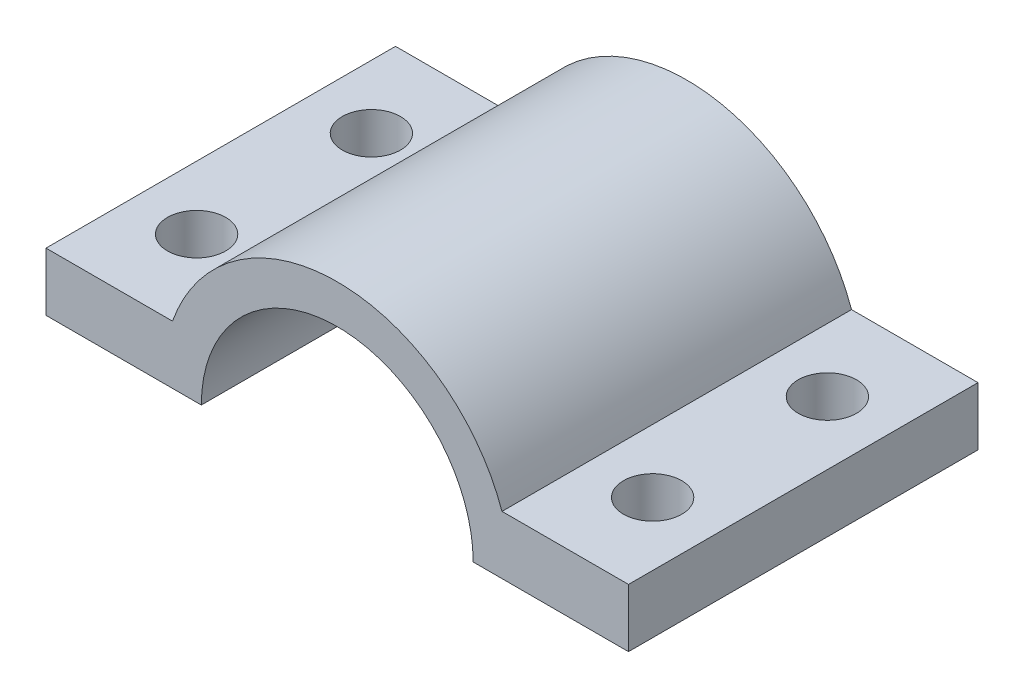
ISO-10303-21;
HEADER;
FILE_DESCRIPTION(('STEP AP214'),'2;1');
FILE_NAME('part.step','',(''),(''),'','','');
FILE_SCHEMA(('AUTOMOTIVE_DESIGN { 1 0 10303 214 1 1 1 1 }'));
ENDSEC;
DATA;
#1=APPLICATION_CONTEXT('core data for automotive mechanical design processes');
#2=APPLICATION_PROTOCOL_DEFINITION('international standard','automotive_design',2000,#1);
#3=PRODUCT_CONTEXT('',#1,'mechanical');
#4=PRODUCT('Part','Part','',(#3));
#5=PRODUCT_RELATED_PRODUCT_CATEGORY('part','',(#4));
#6=PRODUCT_DEFINITION_FORMATION('','',#4);
#7=PRODUCT_DEFINITION_CONTEXT('part definition',#1,'design');
#8=PRODUCT_DEFINITION('design','',#6,#7);
#9=PRODUCT_DEFINITION_SHAPE('','',#8);
#10=(LENGTH_UNIT() NAMED_UNIT(*) SI_UNIT(.MILLI.,.METRE.));
#11=(NAMED_UNIT(*) PLANE_ANGLE_UNIT() SI_UNIT($,.RADIAN.));
#12=(NAMED_UNIT(*) SI_UNIT($,.STERADIAN.) SOLID_ANGLE_UNIT());
#13=UNCERTAINTY_MEASURE_WITH_UNIT(LENGTH_MEASURE(1.E-05),#10,'distance_accuracy_value','');
#14=(GEOMETRIC_REPRESENTATION_CONTEXT(3) GLOBAL_UNCERTAINTY_ASSIGNED_CONTEXT((#13)) GLOBAL_UNIT_ASSIGNED_CONTEXT((#10,
#11,#12)) REPRESENTATION_CONTEXT('',''));
#15=CARTESIAN_POINT('',(0.,0.,0.));
#16=DIRECTION('',(0.,0.,1.));
#17=DIRECTION('',(1.,0.,0.));
#18=AXIS2_PLACEMENT_3D('',#15,#16,#17);
#19=CARTESIAN_POINT('',(15.,0.,18.));
#20=DIRECTION('',(0.,0.,-1.));
#21=DIRECTION('',(-1.,0.,0.));
#22=AXIS2_PLACEMENT_3D('',#19,#20,#21);
#23=CYLINDRICAL_SURFACE('',#22,7.);
#24=CARTESIAN_POINT('',(15.,0.,0.));
#25=DIRECTION('',(0.,0.,-1.));
#26=DIRECTION('',(1.,0.,0.));
#27=AXIS2_PLACEMENT_3D('',#24,#25,#26);
#28=CIRCLE('',#27,7.);
#29=CARTESIAN_POINT('',(8.,0.,0.));
#30=VERTEX_POINT('',#29);
#31=CARTESIAN_POINT('',(22.,0.,0.));
#32=VERTEX_POINT('',#31);
#33=EDGE_CURVE('E155',#30,#32,#28,.T.);
#34=ORIENTED_EDGE('',*,*,#33,.T.);
#35=DIRECTION('',(0.,0.,-1.));
#36=VECTOR('',#35,1.);
#37=CARTESIAN_POINT('',(22.,0.,18.));
#38=LINE('',#37,#36);
#39=CARTESIAN_POINT('',(22.,0.,18.));
#40=VERTEX_POINT('',#39);
#41=EDGE_CURVE('E181',#40,#32,#38,.T.);
#42=ORIENTED_EDGE('',*,*,#41,.F.);
#43=CARTESIAN_POINT('',(15.,0.,18.));
#44=DIRECTION('',(0.,0.,-1.));
#45=DIRECTION('',(1.,0.,0.));
#46=AXIS2_PLACEMENT_3D('',#43,#44,#45);
#47=CIRCLE('',#46,7.);
#48=CARTESIAN_POINT('',(8.,0.,18.));
#49=VERTEX_POINT('',#48);
#50=EDGE_CURVE('E209',#49,#40,#47,.T.);
#51=ORIENTED_EDGE('',*,*,#50,.F.);
#52=DIRECTION('',(0.,0.,-1.));
#53=VECTOR('',#52,1.);
#54=CARTESIAN_POINT('',(8.,0.,18.));
#55=LINE('',#54,#53);
#56=EDGE_CURVE('E185',#49,#30,#55,.T.);
#57=ORIENTED_EDGE('',*,*,#56,.T.);
#58=EDGE_LOOP('',(#34,#42,#51,#57));
#59=FACE_BOUND('',#58,.T.);
#60=CARTESIAN_POINT('',(15.,7.,4.));
#61=CARTESIAN_POINT('',(15.0920423144099,6.99999968878163,4.00000035424175));
#62=CARTESIAN_POINT('',(15.1840912459474,6.99818024168063,4.00363515015069));
#63=CARTESIAN_POINT('',(15.3675098434886,6.99094897507117,4.01813181833705));
#64=CARTESIAN_POINT('',(15.4588791964972,6.98553559276802,4.02899683462421));
#65=CARTESIAN_POINT('',(15.6403496210745,6.97124397952125,4.05784932535751));
#66=CARTESIAN_POINT('',(15.7304486933739,6.96236080765211,4.07584695707158));
#67=CARTESIAN_POINT('',(15.9086133045451,6.9413608446328,4.11875255661509));
#68=CARTESIAN_POINT('',(15.996677996116,6.92924273163147,4.14366334944307));
#69=CARTESIAN_POINT('',(16.2561655346533,6.88857727504872,4.22815470220425));
#70=CARTESIAN_POINT('',(16.4237966808001,6.85564229408617,4.29764260811177));
#71=CARTESIAN_POINT('',(16.7446812861715,6.78110025533086,4.46050291108135));
#72=CARTESIAN_POINT('',(16.8979358777138,6.7394938813422,4.55387342495326));
#73=CARTESIAN_POINT('',(17.1962703111837,6.6484692467107,4.76831109424976));
#74=CARTESIAN_POINT('',(17.3402946907793,6.59873066290762,4.89071210015333));
#75=CARTESIAN_POINT('',(17.6067266040817,6.49810026618281,5.15681574740568));
#76=CARTESIAN_POINT('',(17.7291176651804,6.44720760747976,5.30053446921332));
#77=CARTESIAN_POINT('',(17.9583958757795,6.34545742985882,5.61873160560264));
#78=CARTESIAN_POINT('',(18.0633446360906,6.29490870476829,5.79473110977796));
#79=CARTESIAN_POINT('',(18.1970637882446,6.22746190625372,6.0719426920298));
#80=CARTESIAN_POINT('',(18.2376958820848,6.2063699851756,6.16658278061895));
#81=CARTESIAN_POINT('',(18.3106418179305,6.16776729263203,6.35970070587119));
#82=CARTESIAN_POINT('',(18.3429605767209,6.15025440567137,6.45817623425772));
#83=CARTESIAN_POINT('',(18.3971966084954,6.12045398630934,6.65229509753223));
#84=CARTESIAN_POINT('',(18.4196171617002,6.10791811642048,6.74775993066045));
#85=CARTESIAN_POINT('',(18.4564081915434,6.08717414841307,6.94064739393191));
#86=CARTESIAN_POINT('',(18.4707829392451,6.07896375428019,7.03806895685061));
#87=CARTESIAN_POINT('',(18.4912661285261,6.06722382751253,7.23400742871505));
#88=CARTESIAN_POINT('',(18.4973795484457,6.06369147587863,7.33252364189307));
#89=CARTESIAN_POINT('',(18.5012652780842,6.06144648628816,7.52974259671455));
#90=CARTESIAN_POINT('',(18.4990383836176,6.06273338848898,7.62844531966344));
#91=CARTESIAN_POINT('',(18.4813913580321,6.07290446068902,7.89987954805277));
#92=CARTESIAN_POINT('',(18.4572421640647,6.08681260079294,8.07195151318271));
#93=CARTESIAN_POINT('',(18.3842932670785,6.12766212814205,8.40905928962662));
#94=CARTESIAN_POINT('',(18.3354857117776,6.15460766693963,8.57409284144204));
#95=CARTESIAN_POINT('',(18.213733179273,6.21906330370161,8.89729292534669));
#96=CARTESIAN_POINT('',(18.1402524518213,6.25680486162649,9.0552099637085));
#97=CARTESIAN_POINT('',(17.9716461900501,6.33861871126537,9.35722245720087));
#98=CARTESIAN_POINT('',(17.8765109334219,6.38269384329893,9.5013116625656));
#99=CARTESIAN_POINT('',(17.6532311019628,6.47896066634654,9.79082360940409));
#100=CARTESIAN_POINT('',(17.5224305800686,6.53147289579011,9.93409884942542));
#101=CARTESIAN_POINT('',(17.2384445498302,6.63416677799239,10.1975741732584));
#102=CARTESIAN_POINT('',(17.0852484046567,6.68434730829956,10.317763229142));
#103=CARTESIAN_POINT('',(16.7518077634561,6.77956956563859,10.5368997539326));
#104=CARTESIAN_POINT('',(16.5706375686691,6.82426444851905,10.6346016373073));
#105=CARTESIAN_POINT('',(16.1916317561381,6.90052583639695,10.7973396178904));
#106=CARTESIAN_POINT('',(15.9938095176902,6.93210276236056,10.8624016529102));
#107=CARTESIAN_POINT('',(15.6046827201138,6.97635168155906,10.9526639080949));
#108=CARTESIAN_POINT('',(15.4141953558616,6.99037284048575,10.9807193199351));
#109=CARTESIAN_POINT('',(15.0307286008798,7.00255547112869,11.0051265641469));
#110=CARTESIAN_POINT('',(14.8377504339846,7.0007244560946,11.0014934155292));
#111=CARTESIAN_POINT('',(14.4706845947933,6.98219172808754,10.9642765759673));
#112=CARTESIAN_POINT('',(14.2962920602065,6.96665359612759,10.9330360838395));
#113=CARTESIAN_POINT('',(13.9555758885633,6.92377599897803,10.8451667999782));
#114=CARTESIAN_POINT('',(13.7892531433076,6.89643523275672,10.7885352092985));
#115=CARTESIAN_POINT('',(13.4638898259642,6.83144878810725,10.6500051701122));
#116=CARTESIAN_POINT('',(13.3051934423819,6.79353081894394,10.5674305784221));
#117=CARTESIAN_POINT('',(13.0033854022221,6.7110391441211,10.3801243717263));
#118=CARTESIAN_POINT('',(12.8602804241032,6.66646260554746,10.2753833179694));
#119=CARTESIAN_POINT('',(12.578812397467,6.56978757028176,10.0348354484033));
#120=CARTESIAN_POINT('',(12.4422950348438,6.51738028079185,9.89698800741395));
#121=CARTESIAN_POINT('',(12.1935055714121,6.41418439271684,9.60027393218845));
#122=CARTESIAN_POINT('',(12.0812502426976,6.36339693444786,9.44139287920573));
#123=CARTESIAN_POINT('',(11.8790117178684,6.26678902705796,9.09720024589293));
#124=CARTESIAN_POINT('',(11.7903703767135,6.22132822791453,8.91098131015976));
#125=CARTESIAN_POINT('',(11.6825781402688,6.16411815552892,8.62045736286334));
#126=CARTESIAN_POINT('',(11.6508403304583,6.14687707551194,8.52173908047441));
#127=CARTESIAN_POINT('',(11.5961380356581,6.11675610606326,8.32127444139838));
#128=CARTESIAN_POINT('',(11.5731680129023,6.10387346441261,8.21953003994309));
#129=CARTESIAN_POINT('',(11.5381189317163,6.08405650167029,8.02374417795825));
#130=CARTESIAN_POINT('',(11.5252087644769,6.07667133320285,7.92989594902695));
#131=CARTESIAN_POINT('',(11.5070408489798,6.06624654332213,7.74126316413063));
#132=CARTESIAN_POINT('',(11.5017792356099,6.06320472705765,7.64647910547525));
#133=CARTESIAN_POINT('',(11.4989822367648,6.06159053029171,7.45676833883378));
#134=CARTESIAN_POINT('',(11.5014456833446,6.0630174741623,7.36184165458004));
#135=CARTESIAN_POINT('',(11.5140467970321,6.07026957896268,7.17269652399911));
#136=CARTESIAN_POINT('',(11.5241841499736,6.07609455983879,7.07847804883762));
#137=CARTESIAN_POINT('',(11.5632603094518,6.09833768963088,6.81592486314737));
#138=CARTESIAN_POINT('',(11.6007712532993,6.11951164944129,6.64917986155035));
#139=CARTESIAN_POINT('',(11.6988858926008,6.17298222294381,6.32464006481744));
#140=CARTESIAN_POINT('',(11.7594970164122,6.20528241419211,6.16684816751571));
#141=CARTESIAN_POINT('',(11.9066445334373,6.27999947066274,5.8528225143342));
#142=CARTESIAN_POINT('',(11.9946491347706,6.32295022946689,5.69740569584774));
#143=CARTESIAN_POINT('',(12.1924734831252,6.4132366616388,5.40253576936854));
#144=CARTESIAN_POINT('',(12.302304579659,6.46057460942878,5.26309102637854));
#145=CARTESIAN_POINT('',(12.5562803053793,6.56118004706213,4.98650745447728));
#146=CARTESIAN_POINT('',(12.7029727271861,6.61446912325595,4.85170756154935));
#147=CARTESIAN_POINT('',(13.0184899881074,6.71572662189535,4.60806513006862));
#148=CARTESIAN_POINT('',(13.1873266813362,6.76369216901564,4.49923658291868));
#149=CARTESIAN_POINT('',(13.4547228158562,6.82793309202318,4.35795878176468));
#150=CARTESIAN_POINT('',(13.5466214092062,6.84812946937418,4.31439306377691));
#151=CARTESIAN_POINT('',(13.7344032932169,6.8853032171205,4.23524467138311));
#152=CARTESIAN_POINT('',(13.8302845987376,6.90228216828097,4.19965807514322));
#153=CARTESIAN_POINT('',(14.0251134923341,6.93248138857472,4.13695819862004));
#154=CARTESIAN_POINT('',(14.1240538655967,6.94570984983253,4.10982643753657));
#155=CARTESIAN_POINT('',(14.324333953918,6.96804232760674,4.06430367998564));
#156=CARTESIAN_POINT('',(14.4256721634835,6.97714886339147,4.04590734419921));
#157=CARTESIAN_POINT('',(14.6058708482521,6.9893347128832,4.02136783145113));
#158=CARTESIAN_POINT('',(14.6844219543782,6.99332718368704,4.01336178447095));
#159=CARTESIAN_POINT('',(14.841980406575,6.99865999742693,4.0026776431692));
#160=CARTESIAN_POINT('',(14.9209877651784,7.00000026716037,3.9999996959069));
#161=CARTESIAN_POINT('',(15.,7.,4.));
#162=B_SPLINE_CURVE_WITH_KNOTS('',3,(#60,#61,#62,#63,#64,#65,#66,#67,#68,#69,#70,#71,#72,#73,
#74,#75,#76,#77,#78,#79,#80,#81,#82,#83,#84,#85,#86,#87,#88,#89,#90,#91,#92,#93,#94,#95,#96,#97,
#98,#99,#100,#101,#102,#103,#104,#105,#106,#107,#108,#109,#110,#111,#112,#113,#114,#115,#116,
#117,#118,#119,#120,#121,#122,#123,#124,#125,#126,#127,#128,#129,#130,#131,#132,#133,#134,#135,
#136,#137,#138,#139,#140,#141,#142,#143,#144,#145,#146,#147,#148,#149,#150,#151,#152,#153,#154,
#155,#156,#157,#158,#159,#160,#161),.UNSPECIFIED.,.T.,.F.,(4,2,2,2,2,2,2,2,2,2,2,2,2,2,2,2,2,2,
2,2,2,2,2,2,2,2,2,2,2,2,2,2,2,2,2,2,2,2,2,2,2,2,2,2,2,2,2,2,2,2,4),(0.,0.276048706254923,
0.552217528826471,0.828781053583256,1.10545776027185,1.6560567805127,2.20661239832514,
2.79047539180297,3.37478106807878,4.004399661366,4.31942166901821,4.6342569314765,
4.93041667683205,5.22641905824987,5.52224298666904,5.81803868893806,6.33829111680599,
6.85870931993001,7.39124958842832,7.92402942663902,8.52436412921701,9.12498489348528,
9.75349696003668,10.381508774461,10.9575063490284,11.5332309404329,12.0643329102455,
12.5954934396139,13.1418411435077,13.6884219587231,14.2886775550764,14.8893467840625,
15.5191050581828,15.8340508797689,16.1487974499808,16.4334608375182,16.7179803234941,
17.0024567952944,17.2869216213858,17.801102084832,18.3154480337143,18.8643505134321,
19.4135391661491,20.0294580226096,20.6457079444303,20.9564130859567,21.2669651757734,
21.5768336124543,21.8865124049169,22.1234754078638,22.360444951064),.UNSPECIFIED.);
#163=CARTESIAN_POINT('',(15.,7.,4.));
#164=VERTEX_POINT('',#163);
#165=EDGE_CURVE('E11',#164,#164,#162,.T.);
#166=ORIENTED_EDGE('',*,*,#165,.F.);
#167=EDGE_LOOP('',(#166));
#168=FACE_BOUND('',#167,.T.);
#169=ADVANCED_FACE('F39',(#59,#168),#23,.F.);
#170=CARTESIAN_POINT('',(0.,3.,18.));
#171=DIRECTION('',(1.,0.,0.));
#172=DIRECTION('',(0.,1.,0.));
#173=AXIS2_PLACEMENT_3D('',#170,#171,#172);
#174=PLANE('',#173);
#175=DIRECTION('',(0.,-1.,0.));
#176=VECTOR('',#175,1.);
#177=CARTESIAN_POINT('',(0.,3.,0.));
#178=LINE('',#177,#176);
#179=CARTESIAN_POINT('',(0.,3.,0.));
#180=VERTEX_POINT('',#179);
#181=CARTESIAN_POINT('',(0.,0.,0.));
#182=VERTEX_POINT('',#181);
#183=EDGE_CURVE('E147',#180,#182,#178,.T.);
#184=ORIENTED_EDGE('',*,*,#183,.T.);
#185=DIRECTION('',(0.,0.,-1.));
#186=VECTOR('',#185,1.);
#187=CARTESIAN_POINT('',(0.,0.,18.));
#188=LINE('',#187,#186);
#189=CARTESIAN_POINT('',(0.,0.,18.));
#190=VERTEX_POINT('',#189);
#191=EDGE_CURVE('E54',#190,#182,#188,.T.);
#192=ORIENTED_EDGE('',*,*,#191,.F.);
#193=DIRECTION('',(0.,-1.,0.));
#194=VECTOR('',#193,1.);
#195=CARTESIAN_POINT('',(0.,3.,18.));
#196=LINE('',#195,#194);
#197=CARTESIAN_POINT('',(0.,3.,18.));
#198=VERTEX_POINT('',#197);
#199=EDGE_CURVE('E170',#198,#190,#196,.T.);
#200=ORIENTED_EDGE('',*,*,#199,.F.);
#201=DIRECTION('',(0.,0.,-1.));
#202=VECTOR('',#201,1.);
#203=CARTESIAN_POINT('',(0.,3.,18.));
#204=LINE('',#203,#202);
#205=EDGE_CURVE('E143',#198,#180,#204,.T.);
#206=ORIENTED_EDGE('',*,*,#205,.T.);
#207=EDGE_LOOP('',(#184,#192,#200,#206));
#208=FACE_BOUND('',#207,.T.);
#209=ADVANCED_FACE('F41',(#208),#174,.F.);
#210=CARTESIAN_POINT('',(0.,0.,18.));
#211=DIRECTION('',(0.,1.,0.));
#212=DIRECTION('',(0.,0.,1.));
#213=AXIS2_PLACEMENT_3D('',#210,#211,#212);
#214=PLANE('',#213);
#215=CARTESIAN_POINT('',(3.25735931288072,0.,13.5));
#216=DIRECTION('',(0.,1.,0.));
#217=DIRECTION('',(-1.,0.,0.));
#218=AXIS2_PLACEMENT_3D('',#215,#216,#217);
#219=CIRCLE('',#218,1.5);
#220=CARTESIAN_POINT('',(1.75735931288072,0.,13.5));
#221=VERTEX_POINT('',#220);
#222=EDGE_CURVE('E227',#221,#221,#219,.T.);
#223=ORIENTED_EDGE('',*,*,#222,.T.);
#224=EDGE_LOOP('',(#223));
#225=FACE_BOUND('',#224,.T.);
#226=CARTESIAN_POINT('',(3.25735931288071,0.,4.5));
#227=DIRECTION('',(0.,1.,0.));
#228=DIRECTION('',(-1.,0.,0.));
#229=AXIS2_PLACEMENT_3D('',#226,#227,#228);
#230=CIRCLE('',#229,1.5);
#231=CARTESIAN_POINT('',(1.75735931288072,0.,4.5));
#232=VERTEX_POINT('',#231);
#233=EDGE_CURVE('E222',#232,#232,#230,.T.);
#234=ORIENTED_EDGE('',*,*,#233,.T.);
#235=EDGE_LOOP('',(#234));
#236=FACE_BOUND('',#235,.T.);
#237=DIRECTION('',(1.,0.,0.));
#238=VECTOR('',#237,1.);
#239=CARTESIAN_POINT('',(0.,0.,0.));
#240=LINE('',#239,#238);
#241=EDGE_CURVE('E151',#182,#30,#240,.T.);
#242=ORIENTED_EDGE('',*,*,#241,.T.);
#243=ORIENTED_EDGE('',*,*,#56,.F.);
#244=DIRECTION('',(1.,0.,0.));
#245=VECTOR('',#244,1.);
#246=CARTESIAN_POINT('',(0.,0.,18.));
#247=LINE('',#246,#245);
#248=EDGE_CURVE('E106',#190,#49,#247,.T.);
#249=ORIENTED_EDGE('',*,*,#248,.F.);
#250=ORIENTED_EDGE('',*,*,#191,.T.);
#251=EDGE_LOOP('',(#242,#243,#249,#250));
#252=FACE_BOUND('',#251,.T.);
#253=ADVANCED_FACE('F190',(#225,#236,#252),#214,.F.);
#254=CARTESIAN_POINT('',(22.,0.,18.));
#255=DIRECTION('',(0.,1.,0.));
#256=DIRECTION('',(0.,0.,1.));
#257=AXIS2_PLACEMENT_3D('',#254,#255,#256);
#258=PLANE('',#257);
#259=CARTESIAN_POINT('',(26.7426406871193,0.,4.5));
#260=DIRECTION('',(0.,1.,0.));
#261=DIRECTION('',(-1.,0.,0.));
#262=AXIS2_PLACEMENT_3D('',#259,#260,#261);
#263=CIRCLE('',#262,1.5);
#264=CARTESIAN_POINT('',(25.2426406871193,0.,4.5));
#265=VERTEX_POINT('',#264);
#266=EDGE_CURVE('E235',#265,#265,#263,.T.);
#267=ORIENTED_EDGE('',*,*,#266,.T.);
#268=EDGE_LOOP('',(#267));
#269=FACE_BOUND('',#268,.T.);
#270=CARTESIAN_POINT('',(26.7426406871193,0.,13.5));
#271=DIRECTION('',(0.,1.,0.));
#272=DIRECTION('',(-1.,0.,0.));
#273=AXIS2_PLACEMENT_3D('',#270,#271,#272);
#274=CIRCLE('',#273,1.5);
#275=CARTESIAN_POINT('',(25.2426406871193,0.,13.5));
#276=VERTEX_POINT('',#275);
#277=EDGE_CURVE('E236',#276,#276,#274,.T.);
#278=ORIENTED_EDGE('',*,*,#277,.T.);
#279=EDGE_LOOP('',(#278));
#280=FACE_BOUND('',#279,.T.);
#281=DIRECTION('',(1.,0.,0.));
#282=VECTOR('',#281,1.);
#283=CARTESIAN_POINT('',(22.,0.,0.));
#284=LINE('',#283,#282);
#285=CARTESIAN_POINT('',(30.,0.,0.));
#286=VERTEX_POINT('',#285);
#287=EDGE_CURVE('E158',#32,#286,#284,.T.);
#288=ORIENTED_EDGE('',*,*,#287,.T.);
#289=DIRECTION('',(0.,0.,-1.));
#290=VECTOR('',#289,1.);
#291=CARTESIAN_POINT('',(30.,0.,18.));
#292=LINE('',#291,#290);
#293=CARTESIAN_POINT('',(30.,0.,18.));
#294=VERTEX_POINT('',#293);
#295=EDGE_CURVE('E177',#294,#286,#292,.T.);
#296=ORIENTED_EDGE('',*,*,#295,.F.);
#297=DIRECTION('',(1.,0.,0.));
#298=VECTOR('',#297,1.);
#299=CARTESIAN_POINT('',(22.,0.,18.));
#300=LINE('',#299,#298);
#301=EDGE_CURVE('E207',#40,#294,#300,.T.);
#302=ORIENTED_EDGE('',*,*,#301,.F.);
#303=ORIENTED_EDGE('',*,*,#41,.T.);
#304=EDGE_LOOP('',(#288,#296,#302,#303));
#305=FACE_BOUND('',#304,.T.);
#306=ADVANCED_FACE('F205',(#269,#280,#305),#258,.F.);
#307=CARTESIAN_POINT('',(30.,0.,18.));
#308=DIRECTION('',(-1.,0.,0.));
#309=DIRECTION('',(0.,0.,1.));
#310=AXIS2_PLACEMENT_3D('',#307,#308,#309);
#311=PLANE('',#310);
#312=DIRECTION('',(0.,1.,0.));
#313=VECTOR('',#312,1.);
#314=CARTESIAN_POINT('',(30.,0.,0.));
#315=LINE('',#314,#313);
#316=CARTESIAN_POINT('',(30.,3.,0.));
#317=VERTEX_POINT('',#316);
#318=EDGE_CURVE('E161',#286,#317,#315,.T.);
#319=ORIENTED_EDGE('',*,*,#318,.T.);
#320=DIRECTION('',(0.,0.,-1.));
#321=VECTOR('',#320,1.);
#322=CARTESIAN_POINT('',(30.,3.,18.));
#323=LINE('',#322,#321);
#324=CARTESIAN_POINT('',(30.,3.,18.));
#325=VERTEX_POINT('',#324);
#326=EDGE_CURVE('E136',#325,#317,#323,.T.);
#327=ORIENTED_EDGE('',*,*,#326,.F.);
#328=DIRECTION('',(0.,1.,0.));
#329=VECTOR('',#328,1.);
#330=CARTESIAN_POINT('',(30.,0.,18.));
#331=LINE('',#330,#329);
#332=EDGE_CURVE('E125',#294,#325,#331,.T.);
#333=ORIENTED_EDGE('',*,*,#332,.F.);
#334=ORIENTED_EDGE('',*,*,#295,.T.);
#335=EDGE_LOOP('',(#319,#327,#333,#334));
#336=FACE_BOUND('',#335,.T.);
#337=ADVANCED_FACE('F265',(#336),#311,.F.);
#338=CARTESIAN_POINT('',(30.,3.,18.));
#339=DIRECTION('',(0.,-1.,0.));
#340=DIRECTION('',(1.,0.,0.));
#341=AXIS2_PLACEMENT_3D('',#338,#339,#340);
#342=PLANE('',#341);
#343=CARTESIAN_POINT('',(26.7426406871193,3.,4.5));
#344=DIRECTION('',(0.,1.,0.));
#345=DIRECTION('',(-1.,0.,0.));
#346=AXIS2_PLACEMENT_3D('',#343,#344,#345);
#347=CIRCLE('',#346,1.5);
#348=CARTESIAN_POINT('',(25.2426406871193,3.,4.5));
#349=VERTEX_POINT('',#348);
#350=EDGE_CURVE('E231',#349,#349,#347,.T.);
#351=ORIENTED_EDGE('',*,*,#350,.F.);
#352=EDGE_LOOP('',(#351));
#353=FACE_BOUND('',#352,.T.);
#354=CARTESIAN_POINT('',(26.7426406871193,3.,13.5));
#355=DIRECTION('',(0.,1.,0.));
#356=DIRECTION('',(-1.,0.,0.));
#357=AXIS2_PLACEMENT_3D('',#354,#355,#356);
#358=CIRCLE('',#357,1.5);
#359=CARTESIAN_POINT('',(25.2426406871193,3.,13.5));
#360=VERTEX_POINT('',#359);
#361=EDGE_CURVE('E247',#360,#360,#358,.T.);
#362=ORIENTED_EDGE('',*,*,#361,.F.);
#363=EDGE_LOOP('',(#362));
#364=FACE_BOUND('',#363,.T.);
#365=DIRECTION('',(-1.,0.,0.));
#366=VECTOR('',#365,1.);
#367=CARTESIAN_POINT('',(30.,3.,0.));
#368=LINE('',#367,#366);
#369=CARTESIAN_POINT('',(23.4852813742386,3.,0.));
#370=VERTEX_POINT('',#369);
#371=EDGE_CURVE('E134',#317,#370,#368,.T.);
#372=ORIENTED_EDGE('',*,*,#371,.T.);
#373=DIRECTION('',(0.,0.,-1.));
#374=VECTOR('',#373,1.);
#375=CARTESIAN_POINT('',(23.4852813742386,3.,18.));
#376=LINE('',#375,#374);
#377=CARTESIAN_POINT('',(23.4852813742386,3.,18.));
#378=VERTEX_POINT('',#377);
#379=EDGE_CURVE('E131',#378,#370,#376,.T.);
#380=ORIENTED_EDGE('',*,*,#379,.F.);
#381=DIRECTION('',(-1.,0.,0.));
#382=VECTOR('',#381,1.);
#383=CARTESIAN_POINT('',(30.,3.,18.));
#384=LINE('',#383,#382);
#385=EDGE_CURVE('E119',#325,#378,#384,.T.);
#386=ORIENTED_EDGE('',*,*,#385,.F.);
#387=ORIENTED_EDGE('',*,*,#326,.T.);
#388=EDGE_LOOP('',(#372,#380,#386,#387));
#389=FACE_BOUND('',#388,.T.);
#390=ADVANCED_FACE('F132',(#353,#364,#389),#342,.F.);
#391=CARTESIAN_POINT('',(15.,0.,18.));
#392=DIRECTION('',(0.,0.,-1.));
#393=DIRECTION('',(-1.,0.,0.));
#394=AXIS2_PLACEMENT_3D('',#391,#392,#393);
#395=CYLINDRICAL_SURFACE('',#394,9.);
#396=CARTESIAN_POINT('',(15.,0.,0.));
#397=DIRECTION('',(0.,0.,1.));
#398=DIRECTION('',(1.,0.,0.));
#399=AXIS2_PLACEMENT_3D('',#396,#397,#398);
#400=CIRCLE('',#399,9.);
#401=CARTESIAN_POINT('',(6.51471862576143,3.,0.));
#402=VERTEX_POINT('',#401);
#403=EDGE_CURVE('E91',#370,#402,#400,.T.);
#404=ORIENTED_EDGE('',*,*,#403,.T.);
#405=DIRECTION('',(0.,0.,-1.));
#406=VECTOR('',#405,1.);
#407=CARTESIAN_POINT('',(6.51471862576143,3.,18.));
#408=LINE('',#407,#406);
#409=CARTESIAN_POINT('',(6.51471862576143,3.,18.));
#410=VERTEX_POINT('',#409);
#411=EDGE_CURVE('E137',#410,#402,#408,.T.);
#412=ORIENTED_EDGE('',*,*,#411,.F.);
#413=CARTESIAN_POINT('',(15.,0.,18.));
#414=DIRECTION('',(0.,0.,1.));
#415=DIRECTION('',(1.,0.,0.));
#416=AXIS2_PLACEMENT_3D('',#413,#414,#415);
#417=CIRCLE('',#416,9.);
#418=EDGE_CURVE('E123',#378,#410,#417,.T.);
#419=ORIENTED_EDGE('',*,*,#418,.F.);
#420=ORIENTED_EDGE('',*,*,#379,.T.);
#421=EDGE_LOOP('',(#404,#412,#419,#420));
#422=FACE_BOUND('',#421,.T.);
#423=ADVANCED_FACE('F139',(#422),#395,.T.);
#424=CARTESIAN_POINT('',(6.51471862576143,3.,18.));
#425=DIRECTION('',(0.,-1.,0.));
#426=DIRECTION('',(1.,0.,0.));
#427=AXIS2_PLACEMENT_3D('',#424,#425,#426);
#428=PLANE('',#427);
#429=CARTESIAN_POINT('',(3.25735931288072,3.,13.5));
#430=DIRECTION('',(0.,1.,0.));
#431=DIRECTION('',(-1.,0.,0.));
#432=AXIS2_PLACEMENT_3D('',#429,#430,#431);
#433=CIRCLE('',#432,1.5);
#434=CARTESIAN_POINT('',(1.75735931288072,3.,13.5));
#435=VERTEX_POINT('',#434);
#436=EDGE_CURVE('E240',#435,#435,#433,.T.);
#437=ORIENTED_EDGE('',*,*,#436,.F.);
#438=EDGE_LOOP('',(#437));
#439=FACE_BOUND('',#438,.T.);
#440=CARTESIAN_POINT('',(3.25735931288071,3.,4.5));
#441=DIRECTION('',(0.,1.,0.));
#442=DIRECTION('',(-1.,0.,0.));
#443=AXIS2_PLACEMENT_3D('',#440,#441,#442);
#444=CIRCLE('',#443,1.5);
#445=CARTESIAN_POINT('',(1.75735931288072,3.,4.5));
#446=VERTEX_POINT('',#445);
#447=EDGE_CURVE('E223',#446,#446,#444,.T.);
#448=ORIENTED_EDGE('',*,*,#447,.F.);
#449=EDGE_LOOP('',(#448));
#450=FACE_BOUND('',#449,.T.);
#451=DIRECTION('',(-1.,0.,0.));
#452=VECTOR('',#451,1.);
#453=CARTESIAN_POINT('',(6.51471862576143,3.,0.));
#454=LINE('',#453,#452);
#455=EDGE_CURVE('E97',#402,#180,#454,.T.);
#456=ORIENTED_EDGE('',*,*,#455,.T.);
#457=ORIENTED_EDGE('',*,*,#205,.F.);
#458=DIRECTION('',(-1.,0.,0.));
#459=VECTOR('',#458,1.);
#460=CARTESIAN_POINT('',(6.51471862576143,3.,18.));
#461=LINE('',#460,#459);
#462=EDGE_CURVE('E62',#410,#198,#461,.T.);
#463=ORIENTED_EDGE('',*,*,#462,.F.);
#464=ORIENTED_EDGE('',*,*,#411,.T.);
#465=EDGE_LOOP('',(#456,#457,#463,#464));
#466=FACE_BOUND('',#465,.T.);
#467=ADVANCED_FACE('F272',(#439,#450,#466),#428,.F.);
#468=CARTESIAN_POINT('',(15.,0.,18.));
#469=DIRECTION('',(0.,0.,1.));
#470=DIRECTION('',(1.,0.,0.));
#471=AXIS2_PLACEMENT_3D('',#468,#469,#470);
#472=PLANE('',#471);
#473=ORIENTED_EDGE('',*,*,#199,.T.);
#474=ORIENTED_EDGE('',*,*,#248,.T.);
#475=ORIENTED_EDGE('',*,*,#50,.T.);
#476=ORIENTED_EDGE('',*,*,#301,.T.);
#477=ORIENTED_EDGE('',*,*,#332,.T.);
#478=ORIENTED_EDGE('',*,*,#385,.T.);
#479=ORIENTED_EDGE('',*,*,#418,.T.);
#480=ORIENTED_EDGE('',*,*,#462,.T.);
#481=EDGE_LOOP('',(#473,#474,#475,#476,#477,#478,#479,#480));
#482=FACE_BOUND('',#481,.T.);
#483=ADVANCED_FACE('F121',(#482),#472,.T.);
#484=CARTESIAN_POINT('',(15.,0.,0.));
#485=DIRECTION('',(0.,0.,1.));
#486=DIRECTION('',(1.,0.,0.));
#487=AXIS2_PLACEMENT_3D('',#484,#485,#486);
#488=PLANE('',#487);
#489=ORIENTED_EDGE('',*,*,#183,.F.);
#490=ORIENTED_EDGE('',*,*,#455,.F.);
#491=ORIENTED_EDGE('',*,*,#403,.F.);
#492=ORIENTED_EDGE('',*,*,#371,.F.);
#493=ORIENTED_EDGE('',*,*,#318,.F.);
#494=ORIENTED_EDGE('',*,*,#287,.F.);
#495=ORIENTED_EDGE('',*,*,#33,.F.);
#496=ORIENTED_EDGE('',*,*,#241,.F.);
#497=EDGE_LOOP('',(#489,#490,#491,#492,#493,#494,#495,#496));
#498=FACE_BOUND('',#497,.T.);
#499=ADVANCED_FACE('F195',(#498),#488,.F.);
#500=CARTESIAN_POINT('',(15.,9.002,7.5));
#501=DIRECTION('',(0.,-1.,0.));
#502=DIRECTION('',(0.,0.,-1.));
#503=AXIS2_PLACEMENT_3D('',#500,#501,#502);
#504=CYLINDRICAL_SURFACE('',#503,3.5);
#505=CARTESIAN_POINT('',(15.,4.,7.5));
#506=DIRECTION('',(0.,1.,0.));
#507=DIRECTION('',(0.,0.,1.));
#508=AXIS2_PLACEMENT_3D('',#505,#506,#507);
#509=CIRCLE('',#508,3.5);
#510=CARTESIAN_POINT('',(15.,4.,11.));
#511=VERTEX_POINT('',#510);
#512=EDGE_CURVE('E152',#511,#511,#509,.T.);
#513=ORIENTED_EDGE('',*,*,#512,.T.);
#514=EDGE_LOOP('',(#513));
#515=FACE_BOUND('',#514,.T.);
#516=ORIENTED_EDGE('',*,*,#165,.T.);
#517=EDGE_LOOP('',(#516));
#518=FACE_BOUND('',#517,.T.);
#519=ADVANCED_FACE('F298',(#515,#518),#504,.T.);
#520=CARTESIAN_POINT('',(15.,4.,7.5));
#521=DIRECTION('',(0.,1.,0.));
#522=DIRECTION('',(0.,0.,1.));
#523=AXIS2_PLACEMENT_3D('',#520,#521,#522);
#524=PLANE('',#523);
#525=ORIENTED_EDGE('',*,*,#512,.F.);
#526=EDGE_LOOP('',(#525));
#527=FACE_BOUND('',#526,.T.);
#528=ADVANCED_FACE('F296',(#527),#524,.F.);
#529=CARTESIAN_POINT('',(3.25735931288071,0.,4.5));
#530=DIRECTION('',(0.,1.,0.));
#531=DIRECTION('',(-1.,0.,0.));
#532=AXIS2_PLACEMENT_3D('',#529,#530,#531);
#533=CYLINDRICAL_SURFACE('',#532,1.5);
#534=ORIENTED_EDGE('',*,*,#233,.F.);
#535=EDGE_LOOP('',(#534));
#536=FACE_BOUND('',#535,.T.);
#537=ORIENTED_EDGE('',*,*,#447,.T.);
#538=EDGE_LOOP('',(#537));
#539=FACE_BOUND('',#538,.T.);
#540=ADVANCED_FACE('F293',(#536,#539),#533,.F.);
#541=CARTESIAN_POINT('',(3.25735931288072,0.,13.5));
#542=DIRECTION('',(0.,1.,0.));
#543=DIRECTION('',(-1.,0.,0.));
#544=AXIS2_PLACEMENT_3D('',#541,#542,#543);
#545=CYLINDRICAL_SURFACE('',#544,1.5);
#546=ORIENTED_EDGE('',*,*,#222,.F.);
#547=EDGE_LOOP('',(#546));
#548=FACE_BOUND('',#547,.T.);
#549=ORIENTED_EDGE('',*,*,#436,.T.);
#550=EDGE_LOOP('',(#549));
#551=FACE_BOUND('',#550,.T.);
#552=ADVANCED_FACE('F260',(#548,#551),#545,.F.);
#553=CARTESIAN_POINT('',(26.7426406871193,0.,13.5));
#554=DIRECTION('',(0.,1.,0.));
#555=DIRECTION('',(-1.,0.,0.));
#556=AXIS2_PLACEMENT_3D('',#553,#554,#555);
#557=CYLINDRICAL_SURFACE('',#556,1.5);
#558=ORIENTED_EDGE('',*,*,#277,.F.);
#559=EDGE_LOOP('',(#558));
#560=FACE_BOUND('',#559,.T.);
#561=ORIENTED_EDGE('',*,*,#361,.T.);
#562=EDGE_LOOP('',(#561));
#563=FACE_BOUND('',#562,.T.);
#564=ADVANCED_FACE('F256',(#560,#563),#557,.F.);
#565=CARTESIAN_POINT('',(26.7426406871193,0.,4.5));
#566=DIRECTION('',(0.,1.,0.));
#567=DIRECTION('',(-1.,0.,0.));
#568=AXIS2_PLACEMENT_3D('',#565,#566,#567);
#569=CYLINDRICAL_SURFACE('',#568,1.5);
#570=ORIENTED_EDGE('',*,*,#266,.F.);
#571=EDGE_LOOP('',(#570));
#572=FACE_BOUND('',#571,.T.);
#573=ORIENTED_EDGE('',*,*,#350,.T.);
#574=EDGE_LOOP('',(#573));
#575=FACE_BOUND('',#574,.T.);
#576=ADVANCED_FACE('F259',(#572,#575),#569,.F.);
#577=CLOSED_SHELL('',(#169,#209,#253,#306,#337,#390,#423,#467,#483,#499,#519,#528,#540,#552,
#564,#576));
#578=MANIFOLD_SOLID_BREP('B2',#577);
#579=ADVANCED_BREP_SHAPE_REPRESENTATION('',(#18,#578),#14);
#580=SHAPE_DEFINITION_REPRESENTATION(#9,#579);
ENDSEC;
END-ISO-10303-21;
